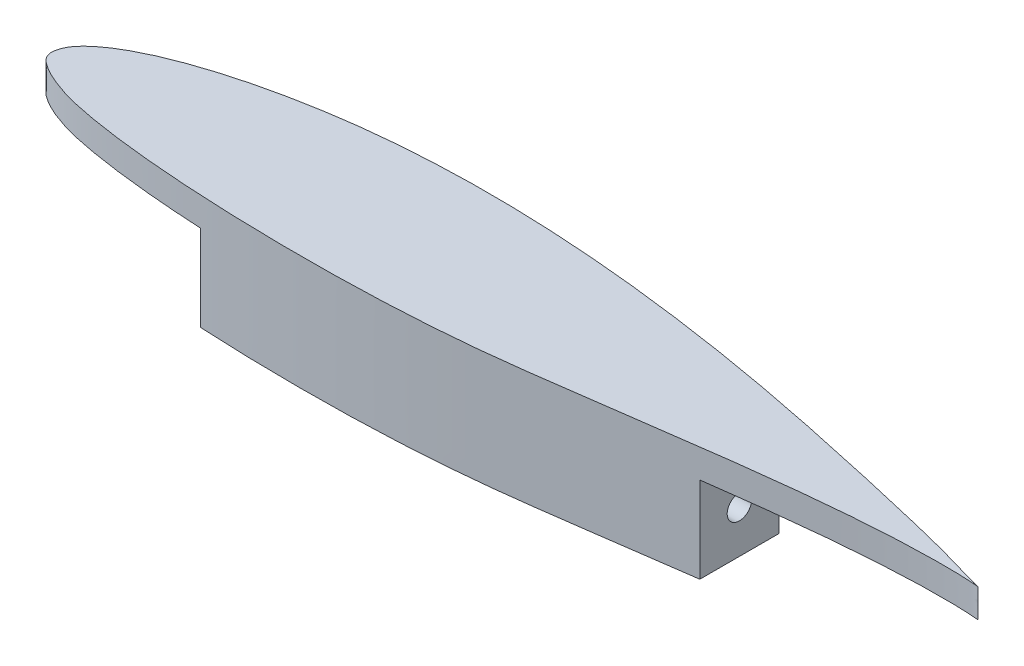
ISO-10303-21;
HEADER;
FILE_DESCRIPTION(('STEP AP214'),'2;1');
FILE_NAME('part.step','',(''),(''),'','','');
FILE_SCHEMA(('AUTOMOTIVE_DESIGN { 1 0 10303 214 1 1 1 1 }'));
ENDSEC;
DATA;
#1=APPLICATION_CONTEXT('core data for automotive mechanical design processes');
#2=APPLICATION_PROTOCOL_DEFINITION('international standard','automotive_design',2000,#1);
#3=PRODUCT_CONTEXT('',#1,'mechanical');
#4=PRODUCT('Part','Part','',(#3));
#5=PRODUCT_RELATED_PRODUCT_CATEGORY('part','',(#4));
#6=PRODUCT_DEFINITION_FORMATION('','',#4);
#7=PRODUCT_DEFINITION_CONTEXT('part definition',#1,'design');
#8=PRODUCT_DEFINITION('design','',#6,#7);
#9=PRODUCT_DEFINITION_SHAPE('','',#8);
#10=(LENGTH_UNIT() NAMED_UNIT(*) SI_UNIT(.MILLI.,.METRE.));
#11=(NAMED_UNIT(*) PLANE_ANGLE_UNIT() SI_UNIT($,.RADIAN.));
#12=(NAMED_UNIT(*) SI_UNIT($,.STERADIAN.) SOLID_ANGLE_UNIT());
#13=UNCERTAINTY_MEASURE_WITH_UNIT(LENGTH_MEASURE(1.E-05),#10,'distance_accuracy_value','');
#14=(GEOMETRIC_REPRESENTATION_CONTEXT(3) GLOBAL_UNCERTAINTY_ASSIGNED_CONTEXT((#13)) GLOBAL_UNIT_ASSIGNED_CONTEXT((#10,
#11,#12)) REPRESENTATION_CONTEXT('',''));
#15=CARTESIAN_POINT('',(0.,0.,0.));
#16=DIRECTION('',(0.,0.,1.));
#17=DIRECTION('',(1.,0.,0.));
#18=AXIS2_PLACEMENT_3D('',#15,#16,#17);
#19=CARTESIAN_POINT('',(102.6,12.7,0.));
#20=CARTESIAN_POINT('',(102.600319100968,12.7,-0.00426545746130378));
#21=CARTESIAN_POINT('',(102.145671458608,12.7,-0.0948589288078441));
#22=CARTESIAN_POINT('',(101.702188288305,12.7,-0.234738717390146));
#23=CARTESIAN_POINT('',(100.655178837176,12.7,-0.522001277230394));
#24=CARTESIAN_POINT('',(99.4142471340612,12.7,-0.895313137084687));
#25=CARTESIAN_POINT('',(97.831906779962,12.7,-1.34682871401426));
#26=CARTESIAN_POINT('',(95.9836785448267,12.7,-1.84114936499114));
#27=CARTESIAN_POINT('',(93.8527861245222,12.7,-2.36886349983629));
#28=CARTESIAN_POINT('',(91.4617652770246,12.7,-2.93983627275321));
#29=CARTESIAN_POINT('',(88.8290798717973,12.7,-3.55467269145796));
#30=CARTESIAN_POINT('',(85.9789973191083,12.7,-4.20308447451175));
#31=CARTESIAN_POINT('',(82.9368868003144,12.7,-4.87666745727852));
#32=CARTESIAN_POINT('',(79.7300505737807,12.7,-5.5694020227015));
#33=CARTESIAN_POINT('',(76.3851470145319,12.7,-6.26516026666066));
#34=CARTESIAN_POINT('',(72.9251545114433,12.7,-6.94866300910745));
#35=CARTESIAN_POINT('',(69.3678079723324,12.7,-7.59861269211938));
#36=CARTESIAN_POINT('',(65.7336075983422,12.7,-8.21181009116921));
#37=CARTESIAN_POINT('',(62.041693266763,12.7,-8.77530639851268));
#38=CARTESIAN_POINT('',(58.3129635507727,12.7,-9.27740028116808));
#39=CARTESIAN_POINT('',(54.5678267311314,12.7,-9.71962914166047));
#40=CARTESIAN_POINT('',(50.8236065748193,12.7,-10.0827060076907));
#41=CARTESIAN_POINT('',(47.100853212161,12.7,-10.3638277921505));
#42=CARTESIAN_POINT('',(43.4173999533663,12.7,-10.5609986342152));
#43=CARTESIAN_POINT('',(39.7893252222442,12.7,-10.66249285103));
#44=CARTESIAN_POINT('',(36.2333324079673,12.7,-10.6728313946037));
#45=CARTESIAN_POINT('',(32.7642447697497,12.7,-10.5855056646579));
#46=CARTESIAN_POINT('',(29.3985832535023,12.7,-10.3978095084346));
#47=CARTESIAN_POINT('',(26.1483851676668,12.7,-10.1206396833539));
#48=CARTESIAN_POINT('',(23.0263199260215,12.7,-9.74943021768554));
#49=CARTESIAN_POINT('',(20.0450454726676,12.7,-9.28575071402093));
#50=CARTESIAN_POINT('',(17.2156005439022,12.7,-8.75364502952457));
#51=CARTESIAN_POINT('',(14.5544796949307,12.7,-8.15520569349336));
#52=CARTESIAN_POINT('',(12.0765276031945,12.7,-7.50502082931607));
#53=CARTESIAN_POINT('',(9.79763026148683,12.7,-6.80596092469361));
#54=CARTESIAN_POINT('',(7.73131408482416,12.7,-6.06822251681709));
#55=CARTESIAN_POINT('',(5.88812440511716,12.7,-5.30328504898485));
#56=CARTESIAN_POINT('',(4.28160872271933,12.7,-4.51133579702939));
#57=CARTESIAN_POINT('',(2.91890224050519,12.7,-3.71013497273947));
#58=CARTESIAN_POINT('',(1.80538503412641,12.7,-2.90892957377533));
#59=CARTESIAN_POINT('',(0.954854012084716,12.7,-2.10607964623105));
#60=CARTESIAN_POINT('',(0.356698699288196,12.7,-1.30360218861639));
#61=CARTESIAN_POINT('',(0.049873754630109,12.7,-0.504187391430668));
#62=CARTESIAN_POINT('',(-0.0390509308875392,12.7,0.265839679692439));
#63=CARTESIAN_POINT('',(0.282403348396628,12.7,0.995387884967201));
#64=CARTESIAN_POINT('',(0.991514518551675,12.7,1.55472283373588));
#65=CARTESIAN_POINT('',(1.93374297950261,12.7,2.13632218210171));
#66=CARTESIAN_POINT('',(3.17065417887256,12.7,2.69472701855353));
#67=CARTESIAN_POINT('',(4.66822177543382,12.7,3.23083153626254));
#68=CARTESIAN_POINT('',(6.44283126249782,12.7,3.69794039500567));
#69=CARTESIAN_POINT('',(8.48809233085839,12.7,4.10230864164829));
#70=CARTESIAN_POINT('',(10.7939111056645,12.7,4.47373853998849));
#71=CARTESIAN_POINT('',(13.3479043821343,12.7,4.79707867871584));
#72=CARTESIAN_POINT('',(16.1284826884662,12.7,5.08250023144459));
#73=CARTESIAN_POINT('',(19.1177603549255,12.7,5.3206835652336));
#74=CARTESIAN_POINT('',(22.29488510447,12.7,5.51248551392663));
#75=CARTESIAN_POINT('',(25.6383956694429,12.7,5.65736103533133));
#76=CARTESIAN_POINT('',(29.1259091216952,12.7,5.74951975164528));
#77=CARTESIAN_POINT('',(32.7334175846547,12.7,5.78802063163488));
#78=CARTESIAN_POINT('',(36.4371499107493,12.7,5.76995187010242));
#79=CARTESIAN_POINT('',(40.2145399202679,12.7,5.68285163781524));
#80=CARTESIAN_POINT('',(44.0462794713224,12.7,5.5236852293336));
#81=CARTESIAN_POINT('',(47.9128445103003,12.7,5.28005594878711));
#82=CARTESIAN_POINT('',(51.807317919473,12.7,4.94306005543755));
#83=CARTESIAN_POINT('',(55.7299364668624,12.7,4.49003319342338));
#84=CARTESIAN_POINT('',(59.6849029081578,12.7,3.96726339043983));
#85=CARTESIAN_POINT('',(63.6600713288434,12.7,3.41182843038018));
#86=CARTESIAN_POINT('',(67.6253729327894,12.7,2.84510738176938));
#87=CARTESIAN_POINT('',(71.5496048973305,12.7,2.28967090792503));
#88=CARTESIAN_POINT('',(75.3983450202911,12.7,1.76259248213287));
#89=CARTESIAN_POINT('',(79.1352750577651,12.7,1.28202970146598));
#90=CARTESIAN_POINT('',(82.7227576645311,12.7,0.861179280883338));
#91=CARTESIAN_POINT('',(86.1218686190719,12.7,0.508160092693143));
#92=CARTESIAN_POINT('',(89.2938699515947,12.7,0.232078070062918));
#93=CARTESIAN_POINT('',(92.1990500746502,12.7,0.0304660172188089));
#94=CARTESIAN_POINT('',(94.8034448815706,12.7,-0.0968748584900715));
#95=CARTESIAN_POINT('',(97.0639859745176,12.7,-0.158580855397816));
#96=CARTESIAN_POINT('',(98.9790956183728,12.7,-0.163918067027612));
#97=CARTESIAN_POINT('',(100.444029842826,12.7,-0.141442406867842));
#98=CARTESIAN_POINT('',(101.633023734928,12.7,-0.0720657713346673));
#99=CARTESIAN_POINT('',(102.123616117507,12.7,-0.0557333791977478));
#100=CARTESIAN_POINT('',(102.599678342847,12.7,0.00429962626551609));
#101=CARTESIAN_POINT('',(102.6,12.7,0.));
#102=B_SPLINE_CURVE_WITH_KNOTS('',3,(#19,#20,#21,#22,#23,#24,#25,#26,#27,#28,#29,#30,#31,#32,
#33,#34,#35,#36,#37,#38,#39,#40,#41,#42,#43,#44,#45,#46,#47,#48,#49,#50,#51,#52,#53,#54,#55,#56,
#57,#58,#59,#60,#61,#62,#63,#64,#65,#66,#67,#68,#69,#70,#71,#72,#73,#74,#75,#76,#77,#78,#79,#80,
#81,#82,#83,#84,#85,#86,#87,#88,#89,#90,#91,#92,#93,#94,#95,#96,#97,#98,#99,#100,#101),
.UNSPECIFIED.,.T.,.F.,(4,1,1,1,1,1,1,1,1,1,1,1,1,1,1,1,1,1,1,1,1,1,1,1,1,1,1,1,1,1,1,1,1,1,1,1,
1,1,1,1,1,1,1,1,1,1,1,1,1,1,1,1,1,1,1,1,1,1,1,1,1,1,1,1,1,1,1,1,1,1,1,1,1,1,1,1,1,1,1,1,4),(0.,
0.00105659195749191,0.00409729381464081,0.00889802027883719,0.0152599548256916,
0.0230192304288229,0.0321018273462973,0.0425130328993016,0.0541992417678609,0.0670476970925263,
0.0809363616035993,0.0957432965005663,0.111332430046818,0.1275665876289,0.144301819148836,
0.16145876205131,0.178962821279436,0.196683551822313,0.214537428159823,0.232435590196003,
0.250280432548269,0.267999885679968,0.285494311599725,0.302703722711085,0.319580769529758,
0.33603058943138,0.35201851010946,0.367484559988411,0.382386516360141,0.396695769271879,
0.410359211806012,0.423299250875422,0.435455132683364,0.446762265844214,0.45716837398753,
0.466628426980185,0.475110843113141,0.482604448160699,0.489075589661717,0.494562151770066,
0.499184408687625,0.50315212295651,0.506644236899572,0.509898128327218,0.513968073266875,
0.519248926069612,0.5256709166663,0.53319111208705,0.541844761899309,0.551720987594283,
0.562815354361238,0.575033589809761,0.588305732459276,0.602540571257671,0.617651858514034,
0.633542515934535,0.650104607444103,0.667235371494974,0.68481744479855,0.702744299702535,
0.720935174142833,0.739321764343781,0.757804969352547,0.776487637955007,0.795439478508483,
0.814505578489861,0.833535799789355,0.852371504335792,0.870837033928686,0.888748629373758,
0.905921520891542,0.922174576859656,0.937319325166348,0.951171297771415,0.963571262176302,
0.974351537399953,0.983387974659336,0.990564330835514,0.995766763857856,0.998934944124147,1.),.UNSPECIFIED.);
#103=DIRECTION('',(0.,-1.,0.));
#104=VECTOR('',#103,1.);
#105=SURFACE_OF_LINEAR_EXTRUSION('',#102,#104);
#106=CARTESIAN_POINT('',(102.6,0.,0.));
#107=CARTESIAN_POINT('',(102.600319100968,0.,-0.00426545746130378));
#108=CARTESIAN_POINT('',(102.145671458608,0.,-0.0948589288078441));
#109=CARTESIAN_POINT('',(101.702188288305,0.,-0.234738717390146));
#110=CARTESIAN_POINT('',(100.655178837176,0.,-0.522001277230394));
#111=CARTESIAN_POINT('',(99.4142471340612,0.,-0.895313137084687));
#112=CARTESIAN_POINT('',(97.831906779962,0.,-1.34682871401426));
#113=CARTESIAN_POINT('',(95.9836785448267,0.,-1.84114936499114));
#114=CARTESIAN_POINT('',(93.8527861245222,0.,-2.36886349983629));
#115=CARTESIAN_POINT('',(91.4617652770246,0.,-2.93983627275321));
#116=CARTESIAN_POINT('',(88.8290798717973,0.,-3.55467269145796));
#117=CARTESIAN_POINT('',(85.9789973191083,0.,-4.20308447451175));
#118=CARTESIAN_POINT('',(82.9368868003144,0.,-4.87666745727852));
#119=CARTESIAN_POINT('',(79.7300505737807,0.,-5.5694020227015));
#120=CARTESIAN_POINT('',(76.3851470145319,0.,-6.26516026666066));
#121=CARTESIAN_POINT('',(72.9251545114433,0.,-6.94866300910745));
#122=CARTESIAN_POINT('',(69.3678079723324,0.,-7.59861269211938));
#123=CARTESIAN_POINT('',(65.7336075983422,0.,-8.21181009116921));
#124=CARTESIAN_POINT('',(62.041693266763,0.,-8.77530639851268));
#125=CARTESIAN_POINT('',(58.3129635507727,0.,-9.27740028116808));
#126=CARTESIAN_POINT('',(54.5678267311314,0.,-9.71962914166047));
#127=CARTESIAN_POINT('',(50.8236065748193,0.,-10.0827060076907));
#128=CARTESIAN_POINT('',(47.100853212161,0.,-10.3638277921505));
#129=CARTESIAN_POINT('',(43.4173999533663,0.,-10.5609986342152));
#130=CARTESIAN_POINT('',(39.7893252222442,0.,-10.66249285103));
#131=CARTESIAN_POINT('',(36.2333324079673,0.,-10.6728313946037));
#132=CARTESIAN_POINT('',(32.7642447697497,0.,-10.5855056646579));
#133=CARTESIAN_POINT('',(29.3985832535023,0.,-10.3978095084346));
#134=CARTESIAN_POINT('',(26.1483851676668,0.,-10.1206396833539));
#135=CARTESIAN_POINT('',(23.0263199260215,0.,-9.74943021768554));
#136=CARTESIAN_POINT('',(20.0450454726676,0.,-9.28575071402093));
#137=CARTESIAN_POINT('',(17.2156005439022,0.,-8.75364502952457));
#138=CARTESIAN_POINT('',(14.5544796949307,0.,-8.15520569349336));
#139=CARTESIAN_POINT('',(12.0765276031945,0.,-7.50502082931607));
#140=CARTESIAN_POINT('',(9.79763026148683,0.,-6.80596092469361));
#141=CARTESIAN_POINT('',(7.73131408482416,0.,-6.06822251681709));
#142=CARTESIAN_POINT('',(5.88812440511716,0.,-5.30328504898485));
#143=CARTESIAN_POINT('',(4.28160872271933,0.,-4.51133579702939));
#144=CARTESIAN_POINT('',(2.91890224050519,0.,-3.71013497273947));
#145=CARTESIAN_POINT('',(1.80538503412641,0.,-2.90892957377533));
#146=CARTESIAN_POINT('',(0.954854012084716,0.,-2.10607964623105));
#147=CARTESIAN_POINT('',(0.356698699288196,0.,-1.30360218861639));
#148=CARTESIAN_POINT('',(0.049873754630109,0.,-0.504187391430668));
#149=CARTESIAN_POINT('',(-0.0390509308875392,0.,0.265839679692439));
#150=CARTESIAN_POINT('',(0.282403348396628,0.,0.995387884967201));
#151=CARTESIAN_POINT('',(0.991514518551675,0.,1.55472283373588));
#152=CARTESIAN_POINT('',(1.93374297950261,0.,2.13632218210171));
#153=CARTESIAN_POINT('',(3.17065417887256,0.,2.69472701855353));
#154=CARTESIAN_POINT('',(4.66822177543382,0.,3.23083153626254));
#155=CARTESIAN_POINT('',(6.44283126249782,0.,3.69794039500567));
#156=CARTESIAN_POINT('',(8.48809233085839,0.,4.10230864164829));
#157=CARTESIAN_POINT('',(10.7939111056645,0.,4.47373853998849));
#158=CARTESIAN_POINT('',(13.3479043821343,0.,4.79707867871584));
#159=CARTESIAN_POINT('',(16.1284826884662,0.,5.08250023144459));
#160=CARTESIAN_POINT('',(19.1177603549255,0.,5.3206835652336));
#161=CARTESIAN_POINT('',(22.29488510447,0.,5.51248551392663));
#162=CARTESIAN_POINT('',(25.6383956694429,0.,5.65736103533133));
#163=CARTESIAN_POINT('',(29.1259091216952,0.,5.74951975164528));
#164=CARTESIAN_POINT('',(32.7334175846547,0.,5.78802063163488));
#165=CARTESIAN_POINT('',(36.4371499107493,0.,5.76995187010242));
#166=CARTESIAN_POINT('',(40.2145399202679,0.,5.68285163781524));
#167=CARTESIAN_POINT('',(44.0462794713224,0.,5.5236852293336));
#168=CARTESIAN_POINT('',(47.9128445103003,0.,5.28005594878711));
#169=CARTESIAN_POINT('',(51.807317919473,0.,4.94306005543755));
#170=CARTESIAN_POINT('',(55.7299364668624,0.,4.49003319342338));
#171=CARTESIAN_POINT('',(59.6849029081578,0.,3.96726339043983));
#172=CARTESIAN_POINT('',(63.6600713288434,0.,3.41182843038018));
#173=CARTESIAN_POINT('',(67.6253729327894,0.,2.84510738176938));
#174=CARTESIAN_POINT('',(71.5496048973305,0.,2.28967090792503));
#175=CARTESIAN_POINT('',(75.3983450202911,0.,1.76259248213287));
#176=CARTESIAN_POINT('',(79.1352750577651,0.,1.28202970146598));
#177=CARTESIAN_POINT('',(82.7227576645311,0.,0.861179280883338));
#178=CARTESIAN_POINT('',(86.1218686190719,0.,0.508160092693143));
#179=CARTESIAN_POINT('',(89.2938699515947,0.,0.232078070062918));
#180=CARTESIAN_POINT('',(92.1990500746502,0.,0.0304660172188089));
#181=CARTESIAN_POINT('',(94.8034448815706,0.,-0.0968748584900715));
#182=CARTESIAN_POINT('',(97.0639859745176,0.,-0.158580855397816));
#183=CARTESIAN_POINT('',(98.9790956183728,0.,-0.163918067027612));
#184=CARTESIAN_POINT('',(100.444029842826,0.,-0.141442406867842));
#185=CARTESIAN_POINT('',(101.633023734928,0.,-0.0720657713346673));
#186=CARTESIAN_POINT('',(102.123616117507,0.,-0.0557333791977478));
#187=CARTESIAN_POINT('',(102.599678342847,0.,0.00429962626551609));
#188=CARTESIAN_POINT('',(102.6,0.,0.));
#189=B_SPLINE_CURVE_WITH_KNOTS('',3,(#106,#107,#108,#109,#110,#111,#112,#113,#114,#115,#116,
#117,#118,#119,#120,#121,#122,#123,#124,#125,#126,#127,#128,#129,#130,#131,#132,#133,#134,#135,
#136,#137,#138,#139,#140,#141,#142,#143,#144,#145,#146,#147,#148,#149,#150,#151,#152,#153,#154,
#155,#156,#157,#158,#159,#160,#161,#162,#163,#164,#165,#166,#167,#168,#169,#170,#171,#172,#173,
#174,#175,#176,#177,#178,#179,#180,#181,#182,#183,#184,#185,#186,#187,#188),.UNSPECIFIED.,.T.,
.F.,(4,1,1,1,1,1,1,1,1,1,1,1,1,1,1,1,1,1,1,1,1,1,1,1,1,1,1,1,1,1,1,1,1,1,1,1,1,1,1,1,1,1,1,1,1,
1,1,1,1,1,1,1,1,1,1,1,1,1,1,1,1,1,1,1,1,1,1,1,1,1,1,1,1,1,1,1,1,1,1,1,4),(0.,
0.00105659195749191,0.00409729381464081,0.00889802027883719,0.0152599548256916,
0.0230192304288229,0.0321018273462973,0.0425130328993016,0.0541992417678609,0.0670476970925263,
0.0809363616035993,0.0957432965005663,0.111332430046818,0.1275665876289,0.144301819148836,
0.16145876205131,0.178962821279436,0.196683551822313,0.214537428159823,0.232435590196003,
0.250280432548269,0.267999885679968,0.285494311599725,0.302703722711085,0.319580769529758,
0.33603058943138,0.35201851010946,0.367484559988411,0.382386516360141,0.396695769271879,
0.410359211806012,0.423299250875422,0.435455132683364,0.446762265844214,0.45716837398753,
0.466628426980185,0.475110843113141,0.482604448160699,0.489075589661717,0.494562151770066,
0.499184408687625,0.50315212295651,0.506644236899572,0.509898128327218,0.513968073266875,
0.519248926069612,0.5256709166663,0.53319111208705,0.541844761899309,0.551720987594283,
0.562815354361238,0.575033589809761,0.588305732459276,0.602540571257671,0.617651858514034,
0.633542515934535,0.650104607444103,0.667235371494974,0.68481744479855,0.702744299702535,
0.720935174142833,0.739321764343781,0.757804969352547,0.776487637955007,0.795439478508483,
0.814505578489861,0.833535799789355,0.852371504335792,0.870837033928686,0.888748629373758,
0.905921520891542,0.922174576859656,0.937319325166348,0.951171297771415,0.963571262176302,
0.974351537399953,0.983387974659336,0.990564330835514,0.995766763857856,0.998934944124147,1.),.UNSPECIFIED.);
#190=CARTESIAN_POINT('',(73.775,0.,-6.77692989641944));
#191=VERTEX_POINT('',#190);
#192=CARTESIAN_POINT('',(21.9500000000001,0.,-9.576345915406));
#193=VERTEX_POINT('',#192);
#194=EDGE_CURVE('E73',#191,#193,#189,.T.);
#195=ORIENTED_EDGE('',*,*,#194,.T.);
#196=DIRECTION('',(0.,-1.,0.));
#197=VECTOR('',#196,1.);
#198=CARTESIAN_POINT('',(21.95,12.7,-9.57634591540599));
#199=LINE('',#198,#197);
#200=CARTESIAN_POINT('',(21.95,9.525,-9.57634591540599));
#201=VERTEX_POINT('',#200);
#202=EDGE_CURVE('E140',#201,#193,#199,.T.);
#203=ORIENTED_EDGE('',*,*,#202,.F.);
#204=CARTESIAN_POINT('',(102.6,9.525,0.));
#205=CARTESIAN_POINT('',(102.600319100968,9.525,-0.00426545746130378));
#206=CARTESIAN_POINT('',(102.145671458608,9.525,-0.0948589288078441));
#207=CARTESIAN_POINT('',(101.702188288305,9.525,-0.234738717390146));
#208=CARTESIAN_POINT('',(100.655178837176,9.525,-0.522001277230394));
#209=CARTESIAN_POINT('',(99.4142471340612,9.525,-0.895313137084687));
#210=CARTESIAN_POINT('',(97.831906779962,9.525,-1.34682871401426));
#211=CARTESIAN_POINT('',(95.9836785448267,9.525,-1.84114936499114));
#212=CARTESIAN_POINT('',(93.8527861245222,9.525,-2.36886349983629));
#213=CARTESIAN_POINT('',(91.4617652770246,9.525,-2.93983627275321));
#214=CARTESIAN_POINT('',(88.8290798717973,9.525,-3.55467269145796));
#215=CARTESIAN_POINT('',(85.9789973191083,9.525,-4.20308447451175));
#216=CARTESIAN_POINT('',(82.9368868003144,9.525,-4.87666745727852));
#217=CARTESIAN_POINT('',(79.7300505737807,9.525,-5.5694020227015));
#218=CARTESIAN_POINT('',(76.3851470145319,9.525,-6.26516026666066));
#219=CARTESIAN_POINT('',(72.9251545114433,9.525,-6.94866300910745));
#220=CARTESIAN_POINT('',(69.3678079723324,9.525,-7.59861269211938));
#221=CARTESIAN_POINT('',(65.7336075983422,9.525,-8.21181009116921));
#222=CARTESIAN_POINT('',(62.041693266763,9.525,-8.77530639851268));
#223=CARTESIAN_POINT('',(58.3129635507727,9.525,-9.27740028116808));
#224=CARTESIAN_POINT('',(54.5678267311314,9.525,-9.71962914166047));
#225=CARTESIAN_POINT('',(50.8236065748193,9.525,-10.0827060076907));
#226=CARTESIAN_POINT('',(47.100853212161,9.525,-10.3638277921505));
#227=CARTESIAN_POINT('',(43.4173999533663,9.525,-10.5609986342152));
#228=CARTESIAN_POINT('',(39.7893252222442,9.525,-10.66249285103));
#229=CARTESIAN_POINT('',(36.2333324079673,9.525,-10.6728313946037));
#230=CARTESIAN_POINT('',(32.7642447697497,9.525,-10.5855056646579));
#231=CARTESIAN_POINT('',(29.3985832535023,9.525,-10.3978095084346));
#232=CARTESIAN_POINT('',(26.1483851676668,9.525,-10.1206396833539));
#233=CARTESIAN_POINT('',(23.0263199260215,9.525,-9.74943021768554));
#234=CARTESIAN_POINT('',(20.0450454726676,9.525,-9.28575071402093));
#235=CARTESIAN_POINT('',(17.2156005439022,9.525,-8.75364502952457));
#236=CARTESIAN_POINT('',(14.5544796949307,9.525,-8.15520569349336));
#237=CARTESIAN_POINT('',(12.0765276031945,9.525,-7.50502082931607));
#238=CARTESIAN_POINT('',(9.79763026148683,9.525,-6.80596092469361));
#239=CARTESIAN_POINT('',(7.73131408482416,9.525,-6.06822251681709));
#240=CARTESIAN_POINT('',(5.88812440511716,9.525,-5.30328504898485));
#241=CARTESIAN_POINT('',(4.28160872271933,9.525,-4.51133579702939));
#242=CARTESIAN_POINT('',(2.91890224050519,9.525,-3.71013497273947));
#243=CARTESIAN_POINT('',(1.80538503412641,9.525,-2.90892957377533));
#244=CARTESIAN_POINT('',(0.954854012084716,9.525,-2.10607964623105));
#245=CARTESIAN_POINT('',(0.356698699288196,9.525,-1.30360218861639));
#246=CARTESIAN_POINT('',(0.049873754630109,9.525,-0.504187391430668));
#247=CARTESIAN_POINT('',(-0.0390509308875392,9.525,0.265839679692439));
#248=CARTESIAN_POINT('',(0.282403348396628,9.525,0.995387884967201));
#249=CARTESIAN_POINT('',(0.991514518551675,9.525,1.55472283373588));
#250=CARTESIAN_POINT('',(1.93374297950261,9.525,2.13632218210171));
#251=CARTESIAN_POINT('',(3.17065417887256,9.525,2.69472701855353));
#252=CARTESIAN_POINT('',(4.66822177543382,9.525,3.23083153626254));
#253=CARTESIAN_POINT('',(6.44283126249782,9.525,3.69794039500567));
#254=CARTESIAN_POINT('',(8.48809233085839,9.525,4.10230864164829));
#255=CARTESIAN_POINT('',(10.7939111056645,9.525,4.47373853998849));
#256=CARTESIAN_POINT('',(13.3479043821343,9.525,4.79707867871584));
#257=CARTESIAN_POINT('',(16.1284826884662,9.525,5.08250023144459));
#258=CARTESIAN_POINT('',(19.1177603549255,9.525,5.3206835652336));
#259=CARTESIAN_POINT('',(22.29488510447,9.525,5.51248551392663));
#260=CARTESIAN_POINT('',(25.6383956694429,9.525,5.65736103533133));
#261=CARTESIAN_POINT('',(29.1259091216952,9.525,5.74951975164528));
#262=CARTESIAN_POINT('',(32.7334175846547,9.525,5.78802063163488));
#263=CARTESIAN_POINT('',(36.4371499107493,9.525,5.76995187010242));
#264=CARTESIAN_POINT('',(40.2145399202679,9.525,5.68285163781524));
#265=CARTESIAN_POINT('',(44.0462794713224,9.525,5.5236852293336));
#266=CARTESIAN_POINT('',(47.9128445103003,9.525,5.28005594878711));
#267=CARTESIAN_POINT('',(51.807317919473,9.525,4.94306005543755));
#268=CARTESIAN_POINT('',(55.7299364668624,9.525,4.49003319342338));
#269=CARTESIAN_POINT('',(59.6849029081578,9.525,3.96726339043983));
#270=CARTESIAN_POINT('',(63.6600713288434,9.525,3.41182843038018));
#271=CARTESIAN_POINT('',(67.6253729327894,9.525,2.84510738176938));
#272=CARTESIAN_POINT('',(71.5496048973305,9.525,2.28967090792503));
#273=CARTESIAN_POINT('',(75.3983450202911,9.525,1.76259248213287));
#274=CARTESIAN_POINT('',(79.1352750577651,9.525,1.28202970146598));
#275=CARTESIAN_POINT('',(82.7227576645311,9.525,0.861179280883338));
#276=CARTESIAN_POINT('',(86.1218686190719,9.525,0.508160092693143));
#277=CARTESIAN_POINT('',(89.2938699515947,9.525,0.232078070062918));
#278=CARTESIAN_POINT('',(92.1990500746502,9.525,0.0304660172188089));
#279=CARTESIAN_POINT('',(94.8034448815706,9.525,-0.0968748584900715));
#280=CARTESIAN_POINT('',(97.0639859745176,9.525,-0.158580855397816));
#281=CARTESIAN_POINT('',(98.9790956183728,9.525,-0.163918067027612));
#282=CARTESIAN_POINT('',(100.444029842826,9.525,-0.141442406867842));
#283=CARTESIAN_POINT('',(101.633023734928,9.525,-0.0720657713346673));
#284=CARTESIAN_POINT('',(102.123616117507,9.525,-0.0557333791977478));
#285=CARTESIAN_POINT('',(102.599678342847,9.525,0.00429962626551609));
#286=CARTESIAN_POINT('',(102.6,9.525,0.));
#287=B_SPLINE_CURVE_WITH_KNOTS('',3,(#204,#205,#206,#207,#208,#209,#210,#211,#212,#213,#214,
#215,#216,#217,#218,#219,#220,#221,#222,#223,#224,#225,#226,#227,#228,#229,#230,#231,#232,#233,
#234,#235,#236,#237,#238,#239,#240,#241,#242,#243,#244,#245,#246,#247,#248,#249,#250,#251,#252,
#253,#254,#255,#256,#257,#258,#259,#260,#261,#262,#263,#264,#265,#266,#267,#268,#269,#270,#271,
#272,#273,#274,#275,#276,#277,#278,#279,#280,#281,#282,#283,#284,#285,#286),.UNSPECIFIED.,.T.,
.F.,(4,1,1,1,1,1,1,1,1,1,1,1,1,1,1,1,1,1,1,1,1,1,1,1,1,1,1,1,1,1,1,1,1,1,1,1,1,1,1,1,1,1,1,1,1,
1,1,1,1,1,1,1,1,1,1,1,1,1,1,1,1,1,1,1,1,1,1,1,1,1,1,1,1,1,1,1,1,1,1,1,4),(0.,
0.00105659195749191,0.00409729381464081,0.00889802027883719,0.0152599548256916,
0.0230192304288229,0.0321018273462973,0.0425130328993016,0.0541992417678609,0.0670476970925263,
0.0809363616035993,0.0957432965005663,0.111332430046818,0.1275665876289,0.144301819148836,
0.16145876205131,0.178962821279436,0.196683551822313,0.214537428159823,0.232435590196003,
0.250280432548269,0.267999885679968,0.285494311599725,0.302703722711085,0.319580769529758,
0.33603058943138,0.35201851010946,0.367484559988411,0.382386516360141,0.396695769271879,
0.410359211806012,0.423299250875422,0.435455132683364,0.446762265844214,0.45716837398753,
0.466628426980185,0.475110843113141,0.482604448160699,0.489075589661717,0.494562151770066,
0.499184408687625,0.50315212295651,0.506644236899572,0.509898128327218,0.513968073266875,
0.519248926069612,0.5256709166663,0.53319111208705,0.541844761899309,0.551720987594283,
0.562815354361238,0.575033589809761,0.588305732459276,0.602540571257671,0.617651858514034,
0.633542515934535,0.650104607444103,0.667235371494974,0.68481744479855,0.702744299702535,
0.720935174142833,0.739321764343781,0.757804969352547,0.776487637955007,0.795439478508483,
0.814505578489861,0.833535799789355,0.852371504335792,0.870837033928686,0.888748629373758,
0.905921520891542,0.922174576859656,0.937319325166348,0.951171297771415,0.963571262176302,
0.974351537399953,0.983387974659336,0.990564330835514,0.995766763857856,0.998934944124147,1.),.UNSPECIFIED.);
#288=CARTESIAN_POINT('',(21.95,9.525,5.48503560801317));
#289=VERTEX_POINT('',#288);
#290=EDGE_CURVE('E45',#289,#201,#287,.F.);
#291=ORIENTED_EDGE('',*,*,#290,.F.);
#292=DIRECTION('',(0.,-1.,0.));
#293=VECTOR('',#292,1.);
#294=CARTESIAN_POINT('',(21.95,12.7,5.48503560801317));
#295=LINE('',#294,#293);
#296=CARTESIAN_POINT('',(21.95,0.,5.48503560801314));
#297=VERTEX_POINT('',#296);
#298=EDGE_CURVE('E137',#297,#289,#295,.F.);
#299=ORIENTED_EDGE('',*,*,#298,.F.);
#300=CARTESIAN_POINT('',(73.7750000126555,0.,1.98614921889715));
#301=VERTEX_POINT('',#300);
#302=EDGE_CURVE('E147',#297,#301,#189,.T.);
#303=ORIENTED_EDGE('',*,*,#302,.T.);
#304=DIRECTION('',(0.,-1.,0.));
#305=VECTOR('',#304,1.);
#306=CARTESIAN_POINT('',(73.775,12.7,1.98614922061821));
#307=LINE('',#306,#305);
#308=CARTESIAN_POINT('',(73.775,9.525,1.98614922061821));
#309=VERTEX_POINT('',#308);
#310=EDGE_CURVE('E63',#309,#301,#307,.T.);
#311=ORIENTED_EDGE('',*,*,#310,.F.);
#312=CARTESIAN_POINT('',(73.775,9.525,-6.77692989592807));
#313=VERTEX_POINT('',#312);
#314=EDGE_CURVE('E12',#313,#309,#287,.F.);
#315=ORIENTED_EDGE('',*,*,#314,.F.);
#316=DIRECTION('',(0.,-1.,0.));
#317=VECTOR('',#316,1.);
#318=CARTESIAN_POINT('',(73.775,12.7,-6.77692989592807));
#319=LINE('',#318,#317);
#320=EDGE_CURVE('E145',#191,#313,#319,.F.);
#321=ORIENTED_EDGE('',*,*,#320,.F.);
#322=EDGE_LOOP('',(#195,#203,#291,#299,#303,#311,#315,#321));
#323=FACE_BOUND('',#322,.T.);
#324=CARTESIAN_POINT('',(102.6,12.7,0.));
#325=VERTEX_POINT('',#324);
#326=EDGE_CURVE('E148',#325,#325,#102,.T.);
#327=ORIENTED_EDGE('',*,*,#326,.F.);
#328=EDGE_LOOP('',(#327));
#329=FACE_BOUND('',#328,.T.);
#330=ADVANCED_FACE('F41',(#323,#329),#105,.F.);
#331=CARTESIAN_POINT('',(0.293965733149275,0.,-1.0898833648554));
#332=DIRECTION('',(0.,-1.,0.));
#333=DIRECTION('',(0.,0.,-1.));
#334=AXIS2_PLACEMENT_3D('',#331,#332,#333);
#335=PLANE('',#334);
#336=ORIENTED_EDGE('',*,*,#194,.F.);
#337=DIRECTION('',(0.,0.,1.));
#338=VECTOR('',#337,1.);
#339=CARTESIAN_POINT('',(73.775,0.,-1.0898833648554));
#340=LINE('',#339,#338);
#341=EDGE_CURVE('E168',#191,#301,#340,.T.);
#342=ORIENTED_EDGE('',*,*,#341,.T.);
#343=ORIENTED_EDGE('',*,*,#302,.F.);
#344=DIRECTION('',(0.,0.,-1.));
#345=VECTOR('',#344,1.);
#346=CARTESIAN_POINT('',(21.95,0.,-1.0898833648554));
#347=LINE('',#346,#345);
#348=EDGE_CURVE('E155',#297,#193,#347,.T.);
#349=ORIENTED_EDGE('',*,*,#348,.T.);
#350=EDGE_LOOP('',(#336,#342,#343,#349));
#351=FACE_BOUND('',#350,.T.);
#352=ADVANCED_FACE('F185',(#351),#335,.T.);
#353=CARTESIAN_POINT('',(0.293965733149275,12.7,-1.0898833648554));
#354=DIRECTION('',(0.,-1.,0.));
#355=DIRECTION('',(0.,0.,-1.));
#356=AXIS2_PLACEMENT_3D('',#353,#354,#355);
#357=PLANE('',#356);
#358=ORIENTED_EDGE('',*,*,#326,.T.);
#359=EDGE_LOOP('',(#358));
#360=FACE_BOUND('',#359,.T.);
#361=ADVANCED_FACE('F188',(#360),#357,.F.);
#362=CARTESIAN_POINT('',(21.95,9.525,-10.6641893900356));
#363=DIRECTION('',(-1.,0.,0.));
#364=DIRECTION('',(0.,0.,1.));
#365=AXIS2_PLACEMENT_3D('',#362,#363,#364);
#366=PLANE('',#365);
#367=CARTESIAN_POINT('',(21.95,4.7625,-2.52825439198686));
#368=DIRECTION('',(-1.,0.,0.));
#369=DIRECTION('',(0.,0.,1.));
#370=AXIS2_PLACEMENT_3D('',#367,#368,#369);
#371=CIRCLE('',#370,1.35254999999999);
#372=CARTESIAN_POINT('',(21.95,4.7625,-1.17570439198687));
#373=VERTEX_POINT('',#372);
#374=EDGE_CURVE('E117',#373,#373,#371,.T.);
#375=ORIENTED_EDGE('',*,*,#374,.F.);
#376=EDGE_LOOP('',(#375));
#377=FACE_BOUND('',#376,.T.);
#378=ORIENTED_EDGE('',*,*,#202,.T.);
#379=ORIENTED_EDGE('',*,*,#348,.F.);
#380=ORIENTED_EDGE('',*,*,#298,.T.);
#381=DIRECTION('',(0.,0.,-1.));
#382=VECTOR('',#381,1.);
#383=CARTESIAN_POINT('',(21.95,9.525,-10.6641893900356));
#384=LINE('',#383,#382);
#385=EDGE_CURVE('E133',#289,#201,#384,.T.);
#386=ORIENTED_EDGE('',*,*,#385,.T.);
#387=EDGE_LOOP('',(#378,#379,#380,#386));
#388=FACE_BOUND('',#387,.T.);
#389=ADVANCED_FACE('F182',(#377,#388),#366,.T.);
#390=CARTESIAN_POINT('',(51.3397249343721,9.525,-0.00432100228407034));
#391=DIRECTION('',(0.,-1.,0.));
#392=DIRECTION('',(0.,0.,-1.));
#393=AXIS2_PLACEMENT_3D('',#390,#391,#392);
#394=PLANE('',#393);
#395=ORIENTED_EDGE('',*,*,#290,.T.);
#396=ORIENTED_EDGE('',*,*,#385,.F.);
#397=EDGE_LOOP('',(#395,#396));
#398=FACE_BOUND('',#397,.T.);
#399=ADVANCED_FACE('F179',(#398),#394,.T.);
#400=ORIENTED_EDGE('',*,*,#314,.T.);
#401=DIRECTION('',(0.,0.,1.));
#402=VECTOR('',#401,1.);
#403=CARTESIAN_POINT('',(73.775,9.525,-10.6641893900356));
#404=LINE('',#403,#402);
#405=EDGE_CURVE('E130',#313,#309,#404,.T.);
#406=ORIENTED_EDGE('',*,*,#405,.F.);
#407=EDGE_LOOP('',(#400,#406));
#408=FACE_BOUND('',#407,.T.);
#409=ADVANCED_FACE('F200',(#408),#394,.T.);
#410=CARTESIAN_POINT('',(73.775,9.525,-10.6641893900356));
#411=DIRECTION('',(1.,0.,0.));
#412=DIRECTION('',(0.,0.,-1.));
#413=AXIS2_PLACEMENT_3D('',#410,#411,#412);
#414=PLANE('',#413);
#415=CARTESIAN_POINT('',(73.775,4.7625,-2.39539033765493));
#416=DIRECTION('',(1.,0.,0.));
#417=DIRECTION('',(0.,0.,-1.));
#418=AXIS2_PLACEMENT_3D('',#415,#416,#417);
#419=CIRCLE('',#418,1.35254999999999);
#420=CARTESIAN_POINT('',(73.775,4.7625,-3.74794033765492));
#421=VERTEX_POINT('',#420);
#422=EDGE_CURVE('E116',#421,#421,#419,.T.);
#423=ORIENTED_EDGE('',*,*,#422,.F.);
#424=EDGE_LOOP('',(#423));
#425=FACE_BOUND('',#424,.T.);
#426=ORIENTED_EDGE('',*,*,#320,.T.);
#427=ORIENTED_EDGE('',*,*,#405,.T.);
#428=ORIENTED_EDGE('',*,*,#310,.T.);
#429=ORIENTED_EDGE('',*,*,#341,.F.);
#430=EDGE_LOOP('',(#426,#427,#428,#429));
#431=FACE_BOUND('',#430,.T.);
#432=ADVANCED_FACE('F201',(#425,#431),#414,.T.);
#433=CARTESIAN_POINT('',(63.775,4.7625,-2.39539033765493));
#434=DIRECTION('',(1.,0.,0.));
#435=DIRECTION('',(0.,0.,-1.));
#436=AXIS2_PLACEMENT_3D('',#433,#434,#435);
#437=CONICAL_SURFACE('',#436,1.35254999999999,1.02974425867665);
#438=CARTESIAN_POINT('',(62.9623059697343,4.7625,-2.39539033765493));
#439=VERTEX_POINT('',#438);
#440=VERTEX_LOOP('',#439);
#441=FACE_BOUND('',#440,.T.);
#442=CARTESIAN_POINT('',(63.775,4.7625,-2.39539033765493));
#443=DIRECTION('',(1.,0.,0.));
#444=DIRECTION('',(0.,0.,-1.));
#445=AXIS2_PLACEMENT_3D('',#442,#443,#444);
#446=CIRCLE('',#445,1.35254999999999);
#447=CARTESIAN_POINT('',(63.775,4.7625,-3.74794033765492));
#448=VERTEX_POINT('',#447);
#449=EDGE_CURVE('E122',#448,#448,#446,.T.);
#450=ORIENTED_EDGE('',*,*,#449,.T.);
#451=EDGE_LOOP('',(#450));
#452=FACE_BOUND('',#451,.T.);
#453=ADVANCED_FACE('F203',(#441,#452),#437,.F.);
#454=CARTESIAN_POINT('',(73.775,4.7625,-2.39539033765493));
#455=DIRECTION('',(1.,0.,0.));
#456=DIRECTION('',(0.,0.,-1.));
#457=AXIS2_PLACEMENT_3D('',#454,#455,#456);
#458=CYLINDRICAL_SURFACE('',#457,1.35254999999999);
#459=ORIENTED_EDGE('',*,*,#449,.F.);
#460=EDGE_LOOP('',(#459));
#461=FACE_BOUND('',#460,.T.);
#462=ORIENTED_EDGE('',*,*,#422,.T.);
#463=EDGE_LOOP('',(#462));
#464=FACE_BOUND('',#463,.T.);
#465=ADVANCED_FACE('F109',(#461,#464),#458,.F.);
#466=CARTESIAN_POINT('',(31.95,4.7625,-2.52825439198686));
#467=DIRECTION('',(-1.,0.,0.));
#468=DIRECTION('',(0.,0.,1.));
#469=AXIS2_PLACEMENT_3D('',#466,#467,#468);
#470=CONICAL_SURFACE('',#469,1.35254999999999,1.02974425867665);
#471=CARTESIAN_POINT('',(32.7626940302657,4.7625,-2.52825439198686));
#472=VERTEX_POINT('',#471);
#473=VERTEX_LOOP('',#472);
#474=FACE_BOUND('',#473,.T.);
#475=CARTESIAN_POINT('',(31.95,4.7625,-2.52825439198686));
#476=DIRECTION('',(-1.,0.,0.));
#477=DIRECTION('',(0.,0.,1.));
#478=AXIS2_PLACEMENT_3D('',#475,#476,#477);
#479=CIRCLE('',#478,1.35254999999999);
#480=CARTESIAN_POINT('',(31.95,4.7625,-1.17570439198687));
#481=VERTEX_POINT('',#480);
#482=EDGE_CURVE('E113',#481,#481,#479,.T.);
#483=ORIENTED_EDGE('',*,*,#482,.T.);
#484=EDGE_LOOP('',(#483));
#485=FACE_BOUND('',#484,.T.);
#486=ADVANCED_FACE('F105',(#474,#485),#470,.F.);
#487=CARTESIAN_POINT('',(21.95,4.7625,-2.52825439198686));
#488=DIRECTION('',(-1.,0.,0.));
#489=DIRECTION('',(0.,0.,1.));
#490=AXIS2_PLACEMENT_3D('',#487,#488,#489);
#491=CYLINDRICAL_SURFACE('',#490,1.35254999999999);
#492=ORIENTED_EDGE('',*,*,#482,.F.);
#493=EDGE_LOOP('',(#492));
#494=FACE_BOUND('',#493,.T.);
#495=ORIENTED_EDGE('',*,*,#374,.T.);
#496=EDGE_LOOP('',(#495));
#497=FACE_BOUND('',#496,.T.);
#498=ADVANCED_FACE('F108',(#494,#497),#491,.F.);
#499=CLOSED_SHELL('',(#330,#352,#361,#389,#399,#409,#432,#453,#465,#486,#498));
#500=MANIFOLD_SOLID_BREP('B2',#499);
#501=ADVANCED_BREP_SHAPE_REPRESENTATION('',(#18,#500),#14);
#502=SHAPE_DEFINITION_REPRESENTATION(#9,#501);
ENDSEC;
END-ISO-10303-21;
